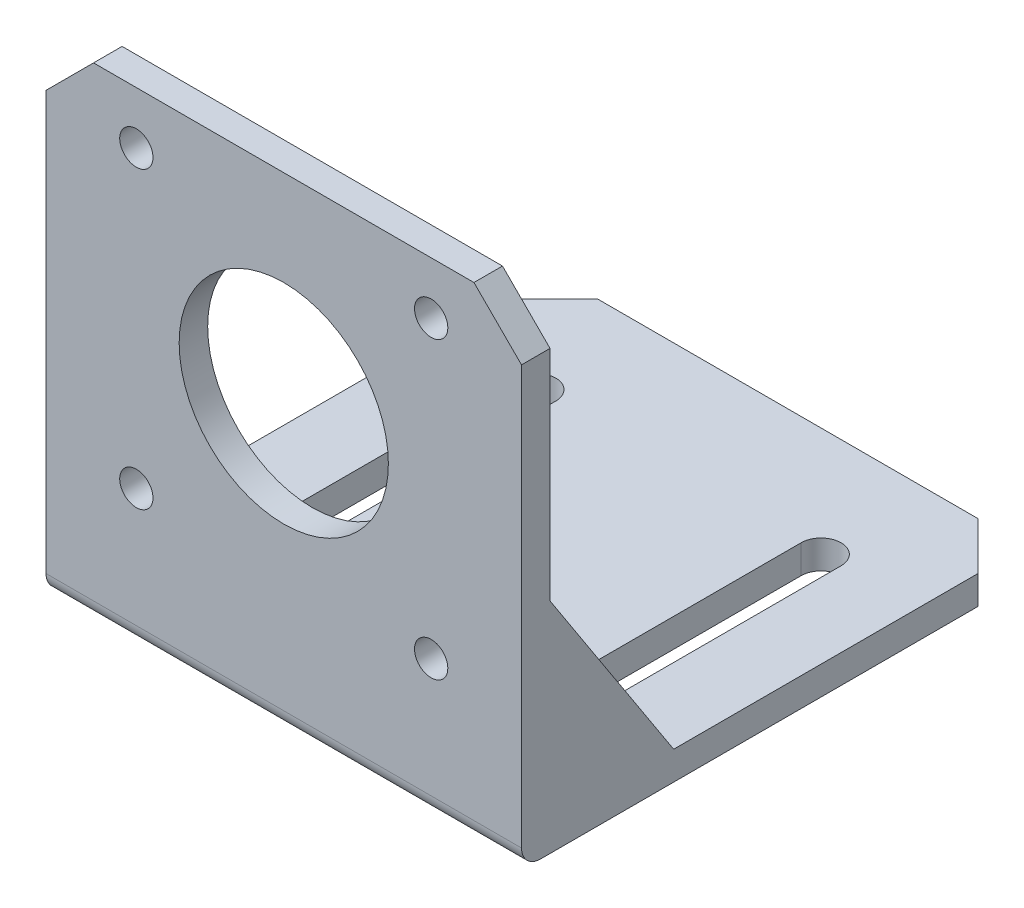
ISO-10303-21;
HEADER;
FILE_DESCRIPTION(('STEP AP214'),'2;1');
FILE_NAME('part.step','',(''),(''),'','','');
FILE_SCHEMA(('AUTOMOTIVE_DESIGN { 1 0 10303 214 1 1 1 1 }'));
ENDSEC;
DATA;
#1=APPLICATION_CONTEXT('core data for automotive mechanical design processes');
#2=APPLICATION_PROTOCOL_DEFINITION('international standard','automotive_design',2000,#1);
#3=PRODUCT_CONTEXT('',#1,'mechanical');
#4=PRODUCT('Part','Part','',(#3));
#5=PRODUCT_RELATED_PRODUCT_CATEGORY('part','',(#4));
#6=PRODUCT_DEFINITION_FORMATION('','',#4);
#7=PRODUCT_DEFINITION_CONTEXT('part definition',#1,'design');
#8=PRODUCT_DEFINITION('design','',#6,#7);
#9=PRODUCT_DEFINITION_SHAPE('','',#8);
#10=(LENGTH_UNIT() NAMED_UNIT(*) SI_UNIT(.MILLI.,.METRE.));
#11=(NAMED_UNIT(*) PLANE_ANGLE_UNIT() SI_UNIT($,.RADIAN.));
#12=(NAMED_UNIT(*) SI_UNIT($,.STERADIAN.) SOLID_ANGLE_UNIT());
#13=UNCERTAINTY_MEASURE_WITH_UNIT(LENGTH_MEASURE(1.E-05),#10,'distance_accuracy_value','');
#14=(GEOMETRIC_REPRESENTATION_CONTEXT(3) GLOBAL_UNCERTAINTY_ASSIGNED_CONTEXT((#13)) GLOBAL_UNIT_ASSIGNED_CONTEXT((#10,
#11,#12)) REPRESENTATION_CONTEXT('',''));
#15=CARTESIAN_POINT('',(0.,0.,0.));
#16=DIRECTION('',(0.,0.,1.));
#17=DIRECTION('',(1.,0.,0.));
#18=AXIS2_PLACEMENT_3D('',#15,#16,#17);
#19=CARTESIAN_POINT('',(50.,3.,-53.));
#20=DIRECTION('',(0.,-1.,0.));
#21=DIRECTION('',(0.,0.,-1.));
#22=AXIS2_PLACEMENT_3D('',#19,#20,#21);
#23=PLANE('',#22);
#24=CARTESIAN_POINT('',(40.,3.,-41.5));
#25=DIRECTION('',(0.,-1.,0.));
#26=DIRECTION('',(0.,0.,-1.));
#27=AXIS2_PLACEMENT_3D('',#24,#25,#26);
#28=CIRCLE('',#27,2.1);
#29=CARTESIAN_POINT('',(42.1,3.,-41.5));
#30=VERTEX_POINT('',#29);
#31=CARTESIAN_POINT('',(37.9,3.,-41.5));
#32=VERTEX_POINT('',#31);
#33=EDGE_CURVE('E260',#30,#32,#28,.F.);
#34=ORIENTED_EDGE('',*,*,#33,.F.);
#35=DIRECTION('',(0.,0.,-1.));
#36=VECTOR('',#35,1.);
#37=CARTESIAN_POINT('',(42.1,3.,-53.));
#38=LINE('',#37,#36);
#39=CARTESIAN_POINT('',(42.1,3.,-11.5));
#40=VERTEX_POINT('',#39);
#41=EDGE_CURVE('E208',#40,#30,#38,.T.);
#42=ORIENTED_EDGE('',*,*,#41,.F.);
#43=CARTESIAN_POINT('',(40.,3.,-11.5));
#44=DIRECTION('',(0.,-1.,0.));
#45=DIRECTION('',(0.,0.,-1.));
#46=AXIS2_PLACEMENT_3D('',#43,#44,#45);
#47=CIRCLE('',#46,2.1);
#48=CARTESIAN_POINT('',(37.9,3.,-11.5));
#49=VERTEX_POINT('',#48);
#50=EDGE_CURVE('E255',#49,#40,#47,.F.);
#51=ORIENTED_EDGE('',*,*,#50,.F.);
#52=DIRECTION('',(0.,0.,1.));
#53=VECTOR('',#52,1.);
#54=CARTESIAN_POINT('',(37.9,3.,-53.));
#55=LINE('',#54,#53);
#56=EDGE_CURVE('E258',#32,#49,#55,.T.);
#57=ORIENTED_EDGE('',*,*,#56,.F.);
#58=EDGE_LOOP('',(#34,#42,#51,#57));
#59=FACE_BOUND('',#58,.T.);
#60=DIRECTION('',(-1.,0.,0.));
#61=VECTOR('',#60,1.);
#62=CARTESIAN_POINT('',(50.,3.,-53.));
#63=LINE('',#62,#61);
#64=CARTESIAN_POINT('',(45.,3.,-53.));
#65=VERTEX_POINT('',#64);
#66=CARTESIAN_POINT('',(4.99999999999999,3.,-53.));
#67=VERTEX_POINT('',#66);
#68=EDGE_CURVE('E369',#65,#67,#63,.T.);
#69=ORIENTED_EDGE('',*,*,#68,.T.);
#70=DIRECTION('',(0.707106781186547,0.,-0.707106781186549));
#71=VECTOR('',#70,1.);
#72=CARTESIAN_POINT('',(4.99999999999999,3.,-53.));
#73=LINE('',#72,#71);
#74=CARTESIAN_POINT('',(0.,3.,-48.));
#75=VERTEX_POINT('',#74);
#76=EDGE_CURVE('E391',#67,#75,#73,.F.);
#77=ORIENTED_EDGE('',*,*,#76,.T.);
#78=DIRECTION('',(0.,0.,1.));
#79=VECTOR('',#78,1.);
#80=CARTESIAN_POINT('',(0.,3.,-53.));
#81=LINE('',#80,#79);
#82=CARTESIAN_POINT('',(0.,3.,-16.));
#83=VERTEX_POINT('',#82);
#84=EDGE_CURVE('E361',#75,#83,#81,.T.);
#85=ORIENTED_EDGE('',*,*,#84,.T.);
#86=DIRECTION('',(-1.,0.,0.));
#87=VECTOR('',#86,1.);
#88=CARTESIAN_POINT('',(3.,3.,-16.));
#89=LINE('',#88,#87);
#90=CARTESIAN_POINT('',(3.,3.,-16.));
#91=VERTEX_POINT('',#90);
#92=EDGE_CURVE('E333',#91,#83,#89,.T.);
#93=ORIENTED_EDGE('',*,*,#92,.F.);
#94=DIRECTION('',(0.,0.,-1.));
#95=VECTOR('',#94,1.);
#96=CARTESIAN_POINT('',(3.,3.,-5.00000000000001));
#97=LINE('',#96,#95);
#98=CARTESIAN_POINT('',(3.,3.,-5.00000000000001));
#99=VERTEX_POINT('',#98);
#100=EDGE_CURVE('E330',#99,#91,#97,.T.);
#101=ORIENTED_EDGE('',*,*,#100,.F.);
#102=DIRECTION('',(-1.,0.,0.));
#103=VECTOR('',#102,1.);
#104=CARTESIAN_POINT('',(50.,3.,-5.00000000000001));
#105=LINE('',#104,#103);
#106=CARTESIAN_POINT('',(47.,3.,-5.00000000000001));
#107=VERTEX_POINT('',#106);
#108=EDGE_CURVE('E367',#107,#99,#105,.T.);
#109=ORIENTED_EDGE('',*,*,#108,.F.);
#110=DIRECTION('',(0.,0.,-1.));
#111=VECTOR('',#110,1.);
#112=CARTESIAN_POINT('',(47.,3.,-5.00000000000001));
#113=LINE('',#112,#111);
#114=CARTESIAN_POINT('',(47.,3.,-16.));
#115=VERTEX_POINT('',#114);
#116=EDGE_CURVE('E310',#107,#115,#113,.T.);
#117=ORIENTED_EDGE('',*,*,#116,.T.);
#118=DIRECTION('',(1.,0.,0.));
#119=VECTOR('',#118,1.);
#120=CARTESIAN_POINT('',(47.,3.,-16.));
#121=LINE('',#120,#119);
#122=CARTESIAN_POINT('',(50.,3.,-16.));
#123=VERTEX_POINT('',#122);
#124=EDGE_CURVE('E315',#115,#123,#121,.T.);
#125=ORIENTED_EDGE('',*,*,#124,.T.);
#126=DIRECTION('',(0.,0.,1.));
#127=VECTOR('',#126,1.);
#128=CARTESIAN_POINT('',(50.,3.,-53.));
#129=LINE('',#128,#127);
#130=CARTESIAN_POINT('',(50.,3.,-48.));
#131=VERTEX_POINT('',#130);
#132=EDGE_CURVE('E349',#131,#123,#129,.T.);
#133=ORIENTED_EDGE('',*,*,#132,.F.);
#134=DIRECTION('',(-0.707106781186549,0.,-0.707106781186547));
#135=VECTOR('',#134,1.);
#136=CARTESIAN_POINT('',(50.,3.,-48.));
#137=LINE('',#136,#135);
#138=EDGE_CURVE('E389',#131,#65,#137,.T.);
#139=ORIENTED_EDGE('',*,*,#138,.T.);
#140=EDGE_LOOP('',(#69,#77,#85,#93,#101,#109,#117,#125,#133,#139));
#141=FACE_BOUND('',#140,.T.);
#142=CARTESIAN_POINT('',(10.,3.,-41.5));
#143=DIRECTION('',(0.,-1.,0.));
#144=DIRECTION('',(0.,0.,-1.));
#145=AXIS2_PLACEMENT_3D('',#142,#143,#144);
#146=CIRCLE('',#145,2.1);
#147=CARTESIAN_POINT('',(12.1,3.,-41.5));
#148=VERTEX_POINT('',#147);
#149=CARTESIAN_POINT('',(7.9,3.,-41.5));
#150=VERTEX_POINT('',#149);
#151=EDGE_CURVE('E205',#148,#150,#146,.F.);
#152=ORIENTED_EDGE('',*,*,#151,.F.);
#153=DIRECTION('',(0.,0.,-1.));
#154=VECTOR('',#153,1.);
#155=CARTESIAN_POINT('',(12.1,3.,-53.));
#156=LINE('',#155,#154);
#157=CARTESIAN_POINT('',(12.1,3.,-11.5));
#158=VERTEX_POINT('',#157);
#159=EDGE_CURVE('E262',#158,#148,#156,.T.);
#160=ORIENTED_EDGE('',*,*,#159,.F.);
#161=CARTESIAN_POINT('',(10.,3.,-11.5));
#162=DIRECTION('',(0.,-1.,0.));
#163=DIRECTION('',(0.,0.,-1.));
#164=AXIS2_PLACEMENT_3D('',#161,#162,#163);
#165=CIRCLE('',#164,2.1);
#166=CARTESIAN_POINT('',(7.9,3.,-11.5));
#167=VERTEX_POINT('',#166);
#168=EDGE_CURVE('E264',#167,#158,#165,.F.);
#169=ORIENTED_EDGE('',*,*,#168,.F.);
#170=DIRECTION('',(0.,0.,1.));
#171=VECTOR('',#170,1.);
#172=CARTESIAN_POINT('',(7.9,3.,-53.));
#173=LINE('',#172,#171);
#174=EDGE_CURVE('E267',#150,#167,#173,.T.);
#175=ORIENTED_EDGE('',*,*,#174,.F.);
#176=EDGE_LOOP('',(#152,#160,#169,#175));
#177=FACE_BOUND('',#176,.T.);
#178=ADVANCED_FACE('F36',(#59,#141,#177),#23,.F.);
#179=CARTESIAN_POINT('',(50.,0.,-2.00000000000001));
#180=DIRECTION('',(0.,1.,0.));
#181=DIRECTION('',(0.,0.,1.));
#182=AXIS2_PLACEMENT_3D('',#179,#180,#181);
#183=PLANE('',#182);
#184=CARTESIAN_POINT('',(40.,0.,-41.5));
#185=DIRECTION('',(0.,1.,0.));
#186=DIRECTION('',(0.,0.,1.));
#187=AXIS2_PLACEMENT_3D('',#184,#185,#186);
#188=CIRCLE('',#187,2.1);
#189=CARTESIAN_POINT('',(42.1,0.,-41.5));
#190=VERTEX_POINT('',#189);
#191=CARTESIAN_POINT('',(37.9,0.,-41.5));
#192=VERTEX_POINT('',#191);
#193=EDGE_CURVE('E236',#190,#192,#188,.T.);
#194=ORIENTED_EDGE('',*,*,#193,.T.);
#195=DIRECTION('',(0.,0.,1.));
#196=VECTOR('',#195,1.);
#197=CARTESIAN_POINT('',(37.9,0.,-41.5));
#198=LINE('',#197,#196);
#199=CARTESIAN_POINT('',(37.9,0.,-11.5));
#200=VERTEX_POINT('',#199);
#201=EDGE_CURVE('E239',#192,#200,#198,.T.);
#202=ORIENTED_EDGE('',*,*,#201,.T.);
#203=CARTESIAN_POINT('',(40.,0.,-11.5));
#204=DIRECTION('',(0.,1.,0.));
#205=DIRECTION('',(0.,0.,1.));
#206=AXIS2_PLACEMENT_3D('',#203,#204,#205);
#207=CIRCLE('',#206,2.1);
#208=CARTESIAN_POINT('',(42.1,0.,-11.5));
#209=VERTEX_POINT('',#208);
#210=EDGE_CURVE('E242',#200,#209,#207,.T.);
#211=ORIENTED_EDGE('',*,*,#210,.T.);
#212=DIRECTION('',(0.,0.,-1.));
#213=VECTOR('',#212,1.);
#214=CARTESIAN_POINT('',(42.1,0.,-41.5));
#215=LINE('',#214,#213);
#216=EDGE_CURVE('E245',#209,#190,#215,.T.);
#217=ORIENTED_EDGE('',*,*,#216,.T.);
#218=EDGE_LOOP('',(#194,#202,#211,#217));
#219=FACE_BOUND('',#218,.T.);
#220=DIRECTION('',(0.,0.,-1.));
#221=VECTOR('',#220,1.);
#222=CARTESIAN_POINT('',(0.,0.,-2.00000000000001));
#223=LINE('',#222,#221);
#224=CARTESIAN_POINT('',(0.,0.,-2.00000000000001));
#225=VERTEX_POINT('',#224);
#226=CARTESIAN_POINT('',(0.,0.,-48.));
#227=VERTEX_POINT('',#226);
#228=EDGE_CURVE('E358',#225,#227,#223,.T.);
#229=ORIENTED_EDGE('',*,*,#228,.T.);
#230=DIRECTION('',(-0.707106781186546,0.,0.707106781186548));
#231=VECTOR('',#230,1.);
#232=CARTESIAN_POINT('',(4.99999999999999,0.,-53.));
#233=LINE('',#232,#231);
#234=CARTESIAN_POINT('',(4.99999999999999,0.,-53.));
#235=VERTEX_POINT('',#234);
#236=EDGE_CURVE('E399',#227,#235,#233,.F.);
#237=ORIENTED_EDGE('',*,*,#236,.T.);
#238=DIRECTION('',(-1.,0.,0.));
#239=VECTOR('',#238,1.);
#240=CARTESIAN_POINT('',(50.,0.,-53.));
#241=LINE('',#240,#239);
#242=CARTESIAN_POINT('',(45.,0.,-53.));
#243=VERTEX_POINT('',#242);
#244=EDGE_CURVE('E372',#243,#235,#241,.T.);
#245=ORIENTED_EDGE('',*,*,#244,.F.);
#246=DIRECTION('',(0.707106781186549,0.,0.707106781186547));
#247=VECTOR('',#246,1.);
#248=CARTESIAN_POINT('',(50.,0.,-48.));
#249=LINE('',#248,#247);
#250=CARTESIAN_POINT('',(50.,0.,-48.));
#251=VERTEX_POINT('',#250);
#252=EDGE_CURVE('E397',#243,#251,#249,.T.);
#253=ORIENTED_EDGE('',*,*,#252,.T.);
#254=DIRECTION('',(0.,0.,-1.));
#255=VECTOR('',#254,1.);
#256=CARTESIAN_POINT('',(50.,0.,-2.00000000000001));
#257=LINE('',#256,#255);
#258=CARTESIAN_POINT('',(50.,0.,-2.00000000000001));
#259=VERTEX_POINT('',#258);
#260=EDGE_CURVE('E346',#259,#251,#257,.T.);
#261=ORIENTED_EDGE('',*,*,#260,.F.);
#262=DIRECTION('',(-1.,0.,0.));
#263=VECTOR('',#262,1.);
#264=CARTESIAN_POINT('',(50.,0.,-2.00000000000001));
#265=LINE('',#264,#263);
#266=EDGE_CURVE('E375',#259,#225,#265,.T.);
#267=ORIENTED_EDGE('',*,*,#266,.T.);
#268=EDGE_LOOP('',(#229,#237,#245,#253,#261,#267));
#269=FACE_BOUND('',#268,.T.);
#270=CARTESIAN_POINT('',(10.,0.,-41.5));
#271=DIRECTION('',(0.,1.,0.));
#272=DIRECTION('',(0.,0.,1.));
#273=AXIS2_PLACEMENT_3D('',#270,#271,#272);
#274=CIRCLE('',#273,2.1);
#275=CARTESIAN_POINT('',(12.1,0.,-41.5));
#276=VERTEX_POINT('',#275);
#277=CARTESIAN_POINT('',(7.9,0.,-41.5));
#278=VERTEX_POINT('',#277);
#279=EDGE_CURVE('E202',#276,#278,#274,.T.);
#280=ORIENTED_EDGE('',*,*,#279,.T.);
#281=DIRECTION('',(0.,0.,1.));
#282=VECTOR('',#281,1.);
#283=CARTESIAN_POINT('',(7.9,0.,-41.5));
#284=LINE('',#283,#282);
#285=CARTESIAN_POINT('',(7.9,0.,-11.5));
#286=VERTEX_POINT('',#285);
#287=EDGE_CURVE('E212',#278,#286,#284,.T.);
#288=ORIENTED_EDGE('',*,*,#287,.T.);
#289=CARTESIAN_POINT('',(10.,0.,-11.5));
#290=DIRECTION('',(0.,1.,0.));
#291=DIRECTION('',(0.,0.,1.));
#292=AXIS2_PLACEMENT_3D('',#289,#290,#291);
#293=CIRCLE('',#292,2.1);
#294=CARTESIAN_POINT('',(12.1,0.,-11.5));
#295=VERTEX_POINT('',#294);
#296=EDGE_CURVE('E218',#286,#295,#293,.T.);
#297=ORIENTED_EDGE('',*,*,#296,.T.);
#298=DIRECTION('',(0.,0.,-1.));
#299=VECTOR('',#298,1.);
#300=CARTESIAN_POINT('',(12.1,0.,-11.5));
#301=LINE('',#300,#299);
#302=EDGE_CURVE('E223',#295,#276,#301,.T.);
#303=ORIENTED_EDGE('',*,*,#302,.T.);
#304=EDGE_LOOP('',(#280,#288,#297,#303));
#305=FACE_BOUND('',#304,.T.);
#306=ADVANCED_FACE('F221',(#219,#269,#305),#183,.F.);
#307=CARTESIAN_POINT('',(50.,5.,-5.));
#308=DIRECTION('',(-1.,0.,0.));
#309=DIRECTION('',(0.,0.,1.));
#310=AXIS2_PLACEMENT_3D('',#307,#308,#309);
#311=CYLINDRICAL_SURFACE('',#310,2.);
#312=CARTESIAN_POINT('',(47.,5.,-5.));
#313=DIRECTION('',(1.,0.,0.));
#314=DIRECTION('',(0.,0.,-1.));
#315=AXIS2_PLACEMENT_3D('',#312,#313,#314);
#316=CIRCLE('',#315,2.);
#317=CARTESIAN_POINT('',(47.,5.00000000000002,-3.));
#318=VERTEX_POINT('',#317);
#319=EDGE_CURVE('E307',#318,#107,#316,.T.);
#320=ORIENTED_EDGE('',*,*,#319,.T.);
#321=ORIENTED_EDGE('',*,*,#108,.T.);
#322=CARTESIAN_POINT('',(3.,5.,-5.));
#323=DIRECTION('',(1.,0.,0.));
#324=DIRECTION('',(0.,0.,-1.));
#325=AXIS2_PLACEMENT_3D('',#322,#323,#324);
#326=CIRCLE('',#325,2.);
#327=CARTESIAN_POINT('',(3.,5.,-3.));
#328=VERTEX_POINT('',#327);
#329=EDGE_CURVE('E327',#328,#99,#326,.T.);
#330=ORIENTED_EDGE('',*,*,#329,.F.);
#331=DIRECTION('',(-1.,0.,0.));
#332=VECTOR('',#331,1.);
#333=CARTESIAN_POINT('',(50.,5.,-3.));
#334=LINE('',#333,#332);
#335=EDGE_CURVE('E365',#318,#328,#334,.T.);
#336=ORIENTED_EDGE('',*,*,#335,.F.);
#337=EDGE_LOOP('',(#320,#321,#330,#336));
#338=FACE_BOUND('',#337,.T.);
#339=ADVANCED_FACE('F474',(#338),#311,.F.);
#340=CARTESIAN_POINT('',(50.,5.00000000000002,-3.));
#341=DIRECTION('',(0.,0.,1.));
#342=DIRECTION('',(1.,0.,0.));
#343=AXIS2_PLACEMENT_3D('',#340,#341,#342);
#344=PLANE('',#343);
#345=CARTESIAN_POINT('',(40.5,14.5,-3.));
#346=DIRECTION('',(0.,0.,1.));
#347=DIRECTION('',(1.,0.,0.));
#348=AXIS2_PLACEMENT_3D('',#345,#346,#347);
#349=CIRCLE('',#348,1.75);
#350=CARTESIAN_POINT('',(42.25,14.5,-3.));
#351=VERTEX_POINT('',#350);
#352=EDGE_CURVE('E290',#351,#351,#349,.T.);
#353=ORIENTED_EDGE('',*,*,#352,.T.);
#354=EDGE_LOOP('',(#353));
#355=FACE_BOUND('',#354,.T.);
#356=CARTESIAN_POINT('',(9.5,14.5,-3.));
#357=DIRECTION('',(0.,0.,1.));
#358=DIRECTION('',(1.,0.,0.));
#359=AXIS2_PLACEMENT_3D('',#356,#357,#358);
#360=CIRCLE('',#359,1.75);
#361=CARTESIAN_POINT('',(11.25,14.5,-3.));
#362=VERTEX_POINT('',#361);
#363=EDGE_CURVE('E284',#362,#362,#360,.T.);
#364=ORIENTED_EDGE('',*,*,#363,.T.);
#365=EDGE_LOOP('',(#364));
#366=FACE_BOUND('',#365,.T.);
#367=CARTESIAN_POINT('',(25.,30.,-3.));
#368=DIRECTION('',(0.,0.,1.));
#369=DIRECTION('',(1.,0.,0.));
#370=AXIS2_PLACEMENT_3D('',#367,#368,#369);
#371=CIRCLE('',#370,11.);
#372=CARTESIAN_POINT('',(36.,30.,-3.));
#373=VERTEX_POINT('',#372);
#374=EDGE_CURVE('E278',#373,#373,#371,.T.);
#375=ORIENTED_EDGE('',*,*,#374,.T.);
#376=EDGE_LOOP('',(#375));
#377=FACE_BOUND('',#376,.T.);
#378=CARTESIAN_POINT('',(40.5,45.5,-3.));
#379=DIRECTION('',(0.,0.,1.));
#380=DIRECTION('',(1.,0.,0.));
#381=AXIS2_PLACEMENT_3D('',#378,#379,#380);
#382=CIRCLE('',#381,1.75);
#383=CARTESIAN_POINT('',(42.25,45.5,-3.));
#384=VERTEX_POINT('',#383);
#385=EDGE_CURVE('E271',#384,#384,#382,.T.);
#386=ORIENTED_EDGE('',*,*,#385,.T.);
#387=EDGE_LOOP('',(#386));
#388=FACE_BOUND('',#387,.T.);
#389=CARTESIAN_POINT('',(9.5,45.5,-3.));
#390=DIRECTION('',(0.,0.,1.));
#391=DIRECTION('',(1.,0.,0.));
#392=AXIS2_PLACEMENT_3D('',#389,#390,#391);
#393=CIRCLE('',#392,1.75);
#394=CARTESIAN_POINT('',(11.25,45.5,-3.));
#395=VERTEX_POINT('',#394);
#396=EDGE_CURVE('E295',#395,#395,#393,.T.);
#397=ORIENTED_EDGE('',*,*,#396,.T.);
#398=EDGE_LOOP('',(#397));
#399=FACE_BOUND('',#398,.T.);
#400=DIRECTION('',(0.,1.,0.));
#401=VECTOR('',#400,1.);
#402=CARTESIAN_POINT('',(0.,5.00000000000002,-3.));
#403=LINE('',#402,#401);
#404=CARTESIAN_POINT('',(0.,23.,-3.));
#405=VERTEX_POINT('',#404);
#406=CARTESIAN_POINT('',(0.,46.,-3.));
#407=VERTEX_POINT('',#406);
#408=EDGE_CURVE('E344',#405,#407,#403,.T.);
#409=ORIENTED_EDGE('',*,*,#408,.T.);
#410=DIRECTION('',(-0.707106781186547,-0.707106781186549,0.));
#411=VECTOR('',#410,1.);
#412=CARTESIAN_POINT('',(4.99999999999999,51.,-3.));
#413=LINE('',#412,#411);
#414=CARTESIAN_POINT('',(4.99999999999999,51.,-3.));
#415=VERTEX_POINT('',#414);
#416=EDGE_CURVE('E11',#407,#415,#413,.F.);
#417=ORIENTED_EDGE('',*,*,#416,.T.);
#418=DIRECTION('',(-1.,0.,0.));
#419=VECTOR('',#418,1.);
#420=CARTESIAN_POINT('',(50.,51.,-3.));
#421=LINE('',#420,#419);
#422=CARTESIAN_POINT('',(45.,51.,-3.));
#423=VERTEX_POINT('',#422);
#424=EDGE_CURVE('E354',#423,#415,#421,.T.);
#425=ORIENTED_EDGE('',*,*,#424,.F.);
#426=DIRECTION('',(0.707106781186549,-0.707106781186547,0.));
#427=VECTOR('',#426,1.);
#428=CARTESIAN_POINT('',(50.,46.,-3.));
#429=LINE('',#428,#427);
#430=CARTESIAN_POINT('',(50.,46.,-3.));
#431=VERTEX_POINT('',#430);
#432=EDGE_CURVE('E45',#423,#431,#429,.T.);
#433=ORIENTED_EDGE('',*,*,#432,.T.);
#434=DIRECTION('',(0.,1.,0.));
#435=VECTOR('',#434,1.);
#436=CARTESIAN_POINT('',(50.,5.00000000000002,-3.));
#437=LINE('',#436,#435);
#438=CARTESIAN_POINT('',(50.,23.,-3.));
#439=VERTEX_POINT('',#438);
#440=EDGE_CURVE('E351',#439,#431,#437,.T.);
#441=ORIENTED_EDGE('',*,*,#440,.F.);
#442=DIRECTION('',(1.,0.,0.));
#443=VECTOR('',#442,1.);
#444=CARTESIAN_POINT('',(47.,23.,-3.));
#445=LINE('',#444,#443);
#446=CARTESIAN_POINT('',(47.,23.,-3.));
#447=VERTEX_POINT('',#446);
#448=EDGE_CURVE('E313',#447,#439,#445,.T.);
#449=ORIENTED_EDGE('',*,*,#448,.F.);
#450=DIRECTION('',(0.,-1.,0.));
#451=VECTOR('',#450,1.);
#452=CARTESIAN_POINT('',(47.,23.,-3.));
#453=LINE('',#452,#451);
#454=EDGE_CURVE('E304',#447,#318,#453,.T.);
#455=ORIENTED_EDGE('',*,*,#454,.T.);
#456=ORIENTED_EDGE('',*,*,#335,.T.);
#457=DIRECTION('',(0.,-1.,0.));
#458=VECTOR('',#457,1.);
#459=CARTESIAN_POINT('',(3.,5.00000000000002,-3.));
#460=LINE('',#459,#458);
#461=CARTESIAN_POINT('',(3.,23.,-3.));
#462=VERTEX_POINT('',#461);
#463=EDGE_CURVE('E324',#462,#328,#460,.T.);
#464=ORIENTED_EDGE('',*,*,#463,.F.);
#465=DIRECTION('',(-1.,0.,0.));
#466=VECTOR('',#465,1.);
#467=CARTESIAN_POINT('',(3.,23.,-3.));
#468=LINE('',#467,#466);
#469=EDGE_CURVE('E338',#462,#405,#468,.T.);
#470=ORIENTED_EDGE('',*,*,#469,.T.);
#471=EDGE_LOOP('',(#409,#417,#425,#433,#441,#449,#455,#456,#464,#470));
#472=FACE_BOUND('',#471,.T.);
#473=ADVANCED_FACE('F416',(#355,#366,#377,#388,#399,#472),#344,.F.);
#474=CARTESIAN_POINT('',(50.,51.,-3.));
#475=DIRECTION('',(0.,-1.,0.));
#476=DIRECTION('',(0.,0.,-1.));
#477=AXIS2_PLACEMENT_3D('',#474,#475,#476);
#478=PLANE('',#477);
#479=ORIENTED_EDGE('',*,*,#424,.T.);
#480=DIRECTION('',(0.,0.,1.));
#481=VECTOR('',#480,1.);
#482=CARTESIAN_POINT('',(4.99999999999999,51.,-3.));
#483=LINE('',#482,#481);
#484=CARTESIAN_POINT('',(4.99999999999999,51.,0.));
#485=VERTEX_POINT('',#484);
#486=EDGE_CURVE('E408',#415,#485,#483,.T.);
#487=ORIENTED_EDGE('',*,*,#486,.T.);
#488=DIRECTION('',(-1.,0.,0.));
#489=VECTOR('',#488,1.);
#490=CARTESIAN_POINT('',(50.,51.,0.));
#491=LINE('',#490,#489);
#492=CARTESIAN_POINT('',(45.,51.,0.));
#493=VERTEX_POINT('',#492);
#494=EDGE_CURVE('E381',#493,#485,#491,.T.);
#495=ORIENTED_EDGE('',*,*,#494,.F.);
#496=DIRECTION('',(0.,0.,-1.));
#497=VECTOR('',#496,1.);
#498=CARTESIAN_POINT('',(45.,51.,-3.));
#499=LINE('',#498,#497);
#500=EDGE_CURVE('E57',#493,#423,#499,.T.);
#501=ORIENTED_EDGE('',*,*,#500,.T.);
#502=EDGE_LOOP('',(#479,#487,#495,#501));
#503=FACE_BOUND('',#502,.T.);
#504=ADVANCED_FACE('F427',(#503),#478,.F.);
#505=CARTESIAN_POINT('',(50.,2.00000000000001,0.));
#506=DIRECTION('',(0.,0.,-1.));
#507=DIRECTION('',(-1.,0.,0.));
#508=AXIS2_PLACEMENT_3D('',#505,#506,#507);
#509=PLANE('',#508);
#510=CARTESIAN_POINT('',(40.5,14.5,0.));
#511=DIRECTION('',(0.,0.,1.));
#512=DIRECTION('',(1.,0.,0.));
#513=AXIS2_PLACEMENT_3D('',#510,#511,#512);
#514=CIRCLE('',#513,1.75);
#515=CARTESIAN_POINT('',(42.25,14.5,0.));
#516=VERTEX_POINT('',#515);
#517=EDGE_CURVE('E270',#516,#516,#514,.T.);
#518=ORIENTED_EDGE('',*,*,#517,.F.);
#519=EDGE_LOOP('',(#518));
#520=FACE_BOUND('',#519,.T.);
#521=CARTESIAN_POINT('',(9.5,14.5,0.));
#522=DIRECTION('',(0.,0.,1.));
#523=DIRECTION('',(1.,0.,0.));
#524=AXIS2_PLACEMENT_3D('',#521,#522,#523);
#525=CIRCLE('',#524,1.75);
#526=CARTESIAN_POINT('',(11.25,14.5,0.));
#527=VERTEX_POINT('',#526);
#528=EDGE_CURVE('E287',#527,#527,#525,.T.);
#529=ORIENTED_EDGE('',*,*,#528,.F.);
#530=EDGE_LOOP('',(#529));
#531=FACE_BOUND('',#530,.T.);
#532=CARTESIAN_POINT('',(25.,30.,0.));
#533=DIRECTION('',(0.,0.,1.));
#534=DIRECTION('',(1.,0.,0.));
#535=AXIS2_PLACEMENT_3D('',#532,#533,#534);
#536=CIRCLE('',#535,11.);
#537=CARTESIAN_POINT('',(36.,30.,0.));
#538=VERTEX_POINT('',#537);
#539=EDGE_CURVE('E281',#538,#538,#536,.T.);
#540=ORIENTED_EDGE('',*,*,#539,.F.);
#541=EDGE_LOOP('',(#540));
#542=FACE_BOUND('',#541,.T.);
#543=CARTESIAN_POINT('',(40.5,45.5,0.));
#544=DIRECTION('',(0.,0.,1.));
#545=DIRECTION('',(1.,0.,0.));
#546=AXIS2_PLACEMENT_3D('',#543,#544,#545);
#547=CIRCLE('',#546,1.75);
#548=CARTESIAN_POINT('',(42.25,45.5,0.));
#549=VERTEX_POINT('',#548);
#550=EDGE_CURVE('E275',#549,#549,#547,.T.);
#551=ORIENTED_EDGE('',*,*,#550,.F.);
#552=EDGE_LOOP('',(#551));
#553=FACE_BOUND('',#552,.T.);
#554=CARTESIAN_POINT('',(9.5,45.5,0.));
#555=DIRECTION('',(0.,0.,1.));
#556=DIRECTION('',(1.,0.,0.));
#557=AXIS2_PLACEMENT_3D('',#554,#555,#556);
#558=CIRCLE('',#557,1.75);
#559=CARTESIAN_POINT('',(11.25,45.5,0.));
#560=VERTEX_POINT('',#559);
#561=EDGE_CURVE('E274',#560,#560,#558,.T.);
#562=ORIENTED_EDGE('',*,*,#561,.F.);
#563=EDGE_LOOP('',(#562));
#564=FACE_BOUND('',#563,.T.);
#565=ORIENTED_EDGE('',*,*,#494,.T.);
#566=DIRECTION('',(0.707106781186546,0.707106781186548,0.));
#567=VECTOR('',#566,1.);
#568=CARTESIAN_POINT('',(4.99999999999999,51.,0.));
#569=LINE('',#568,#567);
#570=CARTESIAN_POINT('',(0.,46.,0.));
#571=VERTEX_POINT('',#570);
#572=EDGE_CURVE('E413',#485,#571,#569,.F.);
#573=ORIENTED_EDGE('',*,*,#572,.T.);
#574=DIRECTION('',(0.,-1.,0.));
#575=VECTOR('',#574,1.);
#576=CARTESIAN_POINT('',(0.,2.00000000000001,0.));
#577=LINE('',#576,#575);
#578=CARTESIAN_POINT('',(0.,2.00000000000001,0.));
#579=VERTEX_POINT('',#578);
#580=EDGE_CURVE('E340',#571,#579,#577,.T.);
#581=ORIENTED_EDGE('',*,*,#580,.T.);
#582=DIRECTION('',(-1.,0.,0.));
#583=VECTOR('',#582,1.);
#584=CARTESIAN_POINT('',(50.,2.00000000000001,0.));
#585=LINE('',#584,#583);
#586=CARTESIAN_POINT('',(50.,2.00000000000001,0.));
#587=VERTEX_POINT('',#586);
#588=EDGE_CURVE('E378',#587,#579,#585,.T.);
#589=ORIENTED_EDGE('',*,*,#588,.F.);
#590=DIRECTION('',(0.,-1.,0.));
#591=VECTOR('',#590,1.);
#592=CARTESIAN_POINT('',(50.,2.00000000000001,0.));
#593=LINE('',#592,#591);
#594=CARTESIAN_POINT('',(50.,46.,0.));
#595=VERTEX_POINT('',#594);
#596=EDGE_CURVE('E341',#595,#587,#593,.T.);
#597=ORIENTED_EDGE('',*,*,#596,.F.);
#598=DIRECTION('',(-0.707106781186549,0.707106781186547,0.));
#599=VECTOR('',#598,1.);
#600=CARTESIAN_POINT('',(50.,46.,0.));
#601=LINE('',#600,#599);
#602=EDGE_CURVE('E411',#595,#493,#601,.T.);
#603=ORIENTED_EDGE('',*,*,#602,.T.);
#604=EDGE_LOOP('',(#565,#573,#581,#589,#597,#603));
#605=FACE_BOUND('',#604,.T.);
#606=ADVANCED_FACE('F425',(#520,#531,#542,#553,#564,#605),#509,.F.);
#607=CARTESIAN_POINT('',(50.,2.,-2.));
#608=DIRECTION('',(-1.,0.,0.));
#609=DIRECTION('',(0.,0.,1.));
#610=AXIS2_PLACEMENT_3D('',#607,#608,#609);
#611=CYLINDRICAL_SURFACE('',#610,2.);
#612=CARTESIAN_POINT('',(0.,2.,-2.));
#613=DIRECTION('',(1.,0.,0.));
#614=DIRECTION('',(0.,0.,-1.));
#615=AXIS2_PLACEMENT_3D('',#612,#613,#614);
#616=CIRCLE('',#615,2.);
#617=EDGE_CURVE('E356',#579,#225,#616,.T.);
#618=ORIENTED_EDGE('',*,*,#617,.T.);
#619=ORIENTED_EDGE('',*,*,#266,.F.);
#620=CARTESIAN_POINT('',(50.,2.,-2.));
#621=DIRECTION('',(1.,0.,0.));
#622=DIRECTION('',(0.,0.,-1.));
#623=AXIS2_PLACEMENT_3D('',#620,#621,#622);
#624=CIRCLE('',#623,2.);
#625=EDGE_CURVE('E343',#587,#259,#624,.T.);
#626=ORIENTED_EDGE('',*,*,#625,.F.);
#627=ORIENTED_EDGE('',*,*,#588,.T.);
#628=EDGE_LOOP('',(#618,#619,#626,#627));
#629=FACE_BOUND('',#628,.T.);
#630=ADVANCED_FACE('F441',(#629),#611,.T.);
#631=CARTESIAN_POINT('',(50.,0.,-53.));
#632=DIRECTION('',(0.,0.,1.));
#633=DIRECTION('',(1.,0.,0.));
#634=AXIS2_PLACEMENT_3D('',#631,#632,#633);
#635=PLANE('',#634);
#636=ORIENTED_EDGE('',*,*,#244,.T.);
#637=DIRECTION('',(0.,1.,0.));
#638=VECTOR('',#637,1.);
#639=CARTESIAN_POINT('',(4.99999999999999,0.,-53.));
#640=LINE('',#639,#638);
#641=EDGE_CURVE('E386',#235,#67,#640,.T.);
#642=ORIENTED_EDGE('',*,*,#641,.T.);
#643=ORIENTED_EDGE('',*,*,#68,.F.);
#644=DIRECTION('',(0.,-1.,0.));
#645=VECTOR('',#644,1.);
#646=CARTESIAN_POINT('',(45.,0.,-53.));
#647=LINE('',#646,#645);
#648=EDGE_CURVE('E384',#65,#243,#647,.T.);
#649=ORIENTED_EDGE('',*,*,#648,.T.);
#650=EDGE_LOOP('',(#636,#642,#643,#649));
#651=FACE_BOUND('',#650,.T.);
#652=ADVANCED_FACE('F457',(#651),#635,.F.);
#653=CARTESIAN_POINT('',(50.,2.,-2.));
#654=DIRECTION('',(1.,0.,0.));
#655=DIRECTION('',(0.,0.,-1.));
#656=AXIS2_PLACEMENT_3D('',#653,#654,#655);
#657=PLANE('',#656);
#658=ORIENTED_EDGE('',*,*,#260,.T.);
#659=DIRECTION('',(0.,1.,0.));
#660=VECTOR('',#659,1.);
#661=CARTESIAN_POINT('',(50.,3.,-48.));
#662=LINE('',#661,#660);
#663=EDGE_CURVE('E404',#251,#131,#662,.T.);
#664=ORIENTED_EDGE('',*,*,#663,.T.);
#665=ORIENTED_EDGE('',*,*,#132,.T.);
#666=DIRECTION('',(0.,0.838443616300637,0.544988350595414));
#667=VECTOR('',#666,1.);
#668=CARTESIAN_POINT('',(50.,3.,-16.));
#669=LINE('',#668,#667);
#670=EDGE_CURVE('E298',#123,#439,#669,.T.);
#671=ORIENTED_EDGE('',*,*,#670,.T.);
#672=ORIENTED_EDGE('',*,*,#440,.T.);
#673=DIRECTION('',(0.,0.,1.));
#674=VECTOR('',#673,1.);
#675=CARTESIAN_POINT('',(50.,46.,0.));
#676=LINE('',#675,#674);
#677=EDGE_CURVE('E401',#431,#595,#676,.T.);
#678=ORIENTED_EDGE('',*,*,#677,.T.);
#679=ORIENTED_EDGE('',*,*,#596,.T.);
#680=ORIENTED_EDGE('',*,*,#625,.T.);
#681=EDGE_LOOP('',(#658,#664,#665,#671,#672,#678,#679,#680));
#682=FACE_BOUND('',#681,.T.);
#683=ADVANCED_FACE('F421',(#682),#657,.T.);
#684=CARTESIAN_POINT('',(0.,2.,-2.));
#685=DIRECTION('',(1.,0.,0.));
#686=DIRECTION('',(0.,0.,-1.));
#687=AXIS2_PLACEMENT_3D('',#684,#685,#686);
#688=PLANE('',#687);
#689=ORIENTED_EDGE('',*,*,#84,.F.);
#690=DIRECTION('',(0.,-1.,0.));
#691=VECTOR('',#690,1.);
#692=CARTESIAN_POINT('',(0.,2.,-48.));
#693=LINE('',#692,#691);
#694=EDGE_CURVE('E395',#75,#227,#693,.T.);
#695=ORIENTED_EDGE('',*,*,#694,.T.);
#696=ORIENTED_EDGE('',*,*,#228,.F.);
#697=ORIENTED_EDGE('',*,*,#617,.F.);
#698=ORIENTED_EDGE('',*,*,#580,.F.);
#699=DIRECTION('',(0.,0.,-1.));
#700=VECTOR('',#699,1.);
#701=CARTESIAN_POINT('',(0.,46.,-2.));
#702=LINE('',#701,#700);
#703=EDGE_CURVE('E393',#571,#407,#702,.T.);
#704=ORIENTED_EDGE('',*,*,#703,.T.);
#705=ORIENTED_EDGE('',*,*,#408,.F.);
#706=DIRECTION('',(0.,0.838443616300637,0.544988350595414));
#707=VECTOR('',#706,1.);
#708=CARTESIAN_POINT('',(0.,3.,-16.));
#709=LINE('',#708,#707);
#710=EDGE_CURVE('E318',#83,#405,#709,.T.);
#711=ORIENTED_EDGE('',*,*,#710,.F.);
#712=EDGE_LOOP('',(#689,#695,#696,#697,#698,#704,#705,#711));
#713=FACE_BOUND('',#712,.T.);
#714=ADVANCED_FACE('F436',(#713),#688,.F.);
#715=CARTESIAN_POINT('',(3.,3.,-16.));
#716=DIRECTION('',(0.,-0.544988350595414,0.838443616300637));
#717=DIRECTION('',(0.,-0.838443616300637,-0.544988350595414));
#718=AXIS2_PLACEMENT_3D('',#715,#716,#717);
#719=PLANE('',#718);
#720=ORIENTED_EDGE('',*,*,#710,.T.);
#721=ORIENTED_EDGE('',*,*,#469,.F.);
#722=DIRECTION('',(0.,0.838443616300637,0.544988350595414));
#723=VECTOR('',#722,1.);
#724=CARTESIAN_POINT('',(3.,3.,-16.));
#725=LINE('',#724,#723);
#726=EDGE_CURVE('E321',#91,#462,#725,.T.);
#727=ORIENTED_EDGE('',*,*,#726,.F.);
#728=ORIENTED_EDGE('',*,*,#92,.T.);
#729=EDGE_LOOP('',(#720,#721,#727,#728));
#730=FACE_BOUND('',#729,.T.);
#731=ADVANCED_FACE('F465',(#730),#719,.F.);
#732=CARTESIAN_POINT('',(3.,5.,-5.));
#733=DIRECTION('',(1.,0.,0.));
#734=DIRECTION('',(0.,0.,-1.));
#735=AXIS2_PLACEMENT_3D('',#732,#733,#734);
#736=PLANE('',#735);
#737=ORIENTED_EDGE('',*,*,#726,.T.);
#738=ORIENTED_EDGE('',*,*,#463,.T.);
#739=ORIENTED_EDGE('',*,*,#329,.T.);
#740=ORIENTED_EDGE('',*,*,#100,.T.);
#741=EDGE_LOOP('',(#737,#738,#739,#740));
#742=FACE_BOUND('',#741,.T.);
#743=ADVANCED_FACE('F470',(#742),#736,.T.);
#744=CARTESIAN_POINT('',(47.,3.,-16.));
#745=DIRECTION('',(0.,0.544988350595414,-0.838443616300637));
#746=DIRECTION('',(0.,0.838443616300637,0.544988350595414));
#747=AXIS2_PLACEMENT_3D('',#744,#745,#746);
#748=PLANE('',#747);
#749=ORIENTED_EDGE('',*,*,#670,.F.);
#750=ORIENTED_EDGE('',*,*,#124,.F.);
#751=DIRECTION('',(0.,0.838443616300637,0.544988350595414));
#752=VECTOR('',#751,1.);
#753=CARTESIAN_POINT('',(47.,3.,-16.));
#754=LINE('',#753,#752);
#755=EDGE_CURVE('E301',#115,#447,#754,.T.);
#756=ORIENTED_EDGE('',*,*,#755,.T.);
#757=ORIENTED_EDGE('',*,*,#448,.T.);
#758=EDGE_LOOP('',(#749,#750,#756,#757));
#759=FACE_BOUND('',#758,.T.);
#760=ADVANCED_FACE('F479',(#759),#748,.T.);
#761=CARTESIAN_POINT('',(47.,5.,-5.));
#762=DIRECTION('',(1.,0.,0.));
#763=DIRECTION('',(0.,0.,-1.));
#764=AXIS2_PLACEMENT_3D('',#761,#762,#763);
#765=PLANE('',#764);
#766=ORIENTED_EDGE('',*,*,#755,.F.);
#767=ORIENTED_EDGE('',*,*,#116,.F.);
#768=ORIENTED_EDGE('',*,*,#319,.F.);
#769=ORIENTED_EDGE('',*,*,#454,.F.);
#770=EDGE_LOOP('',(#766,#767,#768,#769));
#771=FACE_BOUND('',#770,.T.);
#772=ADVANCED_FACE('F477',(#771),#765,.F.);
#773=CARTESIAN_POINT('',(9.5,45.5,-3.));
#774=DIRECTION('',(0.,0.,1.));
#775=DIRECTION('',(1.,0.,0.));
#776=AXIS2_PLACEMENT_3D('',#773,#774,#775);
#777=CYLINDRICAL_SURFACE('',#776,1.75);
#778=ORIENTED_EDGE('',*,*,#396,.F.);
#779=EDGE_LOOP('',(#778));
#780=FACE_BOUND('',#779,.T.);
#781=ORIENTED_EDGE('',*,*,#561,.T.);
#782=EDGE_LOOP('',(#781));
#783=FACE_BOUND('',#782,.T.);
#784=ADVANCED_FACE('F486',(#780,#783),#777,.F.);
#785=CARTESIAN_POINT('',(40.5,45.5,-3.));
#786=DIRECTION('',(0.,0.,1.));
#787=DIRECTION('',(1.,0.,0.));
#788=AXIS2_PLACEMENT_3D('',#785,#786,#787);
#789=CYLINDRICAL_SURFACE('',#788,1.75);
#790=ORIENTED_EDGE('',*,*,#385,.F.);
#791=EDGE_LOOP('',(#790));
#792=FACE_BOUND('',#791,.T.);
#793=ORIENTED_EDGE('',*,*,#550,.T.);
#794=EDGE_LOOP('',(#793));
#795=FACE_BOUND('',#794,.T.);
#796=ADVANCED_FACE('F710',(#792,#795),#789,.F.);
#797=CARTESIAN_POINT('',(25.,30.,-3.));
#798=DIRECTION('',(0.,0.,1.));
#799=DIRECTION('',(1.,0.,0.));
#800=AXIS2_PLACEMENT_3D('',#797,#798,#799);
#801=CYLINDRICAL_SURFACE('',#800,11.);
#802=ORIENTED_EDGE('',*,*,#374,.F.);
#803=EDGE_LOOP('',(#802));
#804=FACE_BOUND('',#803,.T.);
#805=ORIENTED_EDGE('',*,*,#539,.T.);
#806=EDGE_LOOP('',(#805));
#807=FACE_BOUND('',#806,.T.);
#808=ADVANCED_FACE('F700',(#804,#807),#801,.F.);
#809=CARTESIAN_POINT('',(9.5,14.5,-3.));
#810=DIRECTION('',(0.,0.,1.));
#811=DIRECTION('',(1.,0.,0.));
#812=AXIS2_PLACEMENT_3D('',#809,#810,#811);
#813=CYLINDRICAL_SURFACE('',#812,1.75);
#814=ORIENTED_EDGE('',*,*,#363,.F.);
#815=EDGE_LOOP('',(#814));
#816=FACE_BOUND('',#815,.T.);
#817=ORIENTED_EDGE('',*,*,#528,.T.);
#818=EDGE_LOOP('',(#817));
#819=FACE_BOUND('',#818,.T.);
#820=ADVANCED_FACE('F690',(#816,#819),#813,.F.);
#821=CARTESIAN_POINT('',(40.5,14.5,-3.));
#822=DIRECTION('',(0.,0.,1.));
#823=DIRECTION('',(1.,0.,0.));
#824=AXIS2_PLACEMENT_3D('',#821,#822,#823);
#825=CYLINDRICAL_SURFACE('',#824,1.75);
#826=ORIENTED_EDGE('',*,*,#352,.F.);
#827=EDGE_LOOP('',(#826));
#828=FACE_BOUND('',#827,.T.);
#829=ORIENTED_EDGE('',*,*,#517,.T.);
#830=EDGE_LOOP('',(#829));
#831=FACE_BOUND('',#830,.T.);
#832=ADVANCED_FACE('F681',(#828,#831),#825,.F.);
#833=CARTESIAN_POINT('',(40.,11.,-41.5));
#834=DIRECTION('',(0.,-1.,0.));
#835=DIRECTION('',(0.,0.,-1.));
#836=AXIS2_PLACEMENT_3D('',#833,#834,#835);
#837=CYLINDRICAL_SURFACE('',#836,2.1);
#838=ORIENTED_EDGE('',*,*,#33,.T.);
#839=DIRECTION('',(0.,-1.,0.));
#840=VECTOR('',#839,1.);
#841=CARTESIAN_POINT('',(37.9,11.,-41.5));
#842=LINE('',#841,#840);
#843=EDGE_CURVE('E224',#32,#192,#842,.T.);
#844=ORIENTED_EDGE('',*,*,#843,.T.);
#845=ORIENTED_EDGE('',*,*,#193,.F.);
#846=DIRECTION('',(0.,-1.,0.));
#847=VECTOR('',#846,1.);
#848=CARTESIAN_POINT('',(42.1,11.,-41.5));
#849=LINE('',#848,#847);
#850=EDGE_CURVE('E248',#30,#190,#849,.T.);
#851=ORIENTED_EDGE('',*,*,#850,.F.);
#852=EDGE_LOOP('',(#838,#844,#845,#851));
#853=FACE_BOUND('',#852,.T.);
#854=ADVANCED_FACE('F672',(#853),#837,.F.);
#855=CARTESIAN_POINT('',(37.9,11.,-41.5));
#856=DIRECTION('',(1.,0.,0.));
#857=DIRECTION('',(0.,0.,-1.));
#858=AXIS2_PLACEMENT_3D('',#855,#856,#857);
#859=PLANE('',#858);
#860=ORIENTED_EDGE('',*,*,#56,.T.);
#861=DIRECTION('',(0.,-1.,0.));
#862=VECTOR('',#861,1.);
#863=CARTESIAN_POINT('',(37.9,11.,-11.5));
#864=LINE('',#863,#862);
#865=EDGE_CURVE('E226',#49,#200,#864,.T.);
#866=ORIENTED_EDGE('',*,*,#865,.T.);
#867=ORIENTED_EDGE('',*,*,#201,.F.);
#868=ORIENTED_EDGE('',*,*,#843,.F.);
#869=EDGE_LOOP('',(#860,#866,#867,#868));
#870=FACE_BOUND('',#869,.T.);
#871=ADVANCED_FACE('F662',(#870),#859,.T.);
#872=CARTESIAN_POINT('',(40.,11.,-11.5));
#873=DIRECTION('',(0.,-1.,0.));
#874=DIRECTION('',(0.,0.,-1.));
#875=AXIS2_PLACEMENT_3D('',#872,#873,#874);
#876=CYLINDRICAL_SURFACE('',#875,2.1);
#877=ORIENTED_EDGE('',*,*,#50,.T.);
#878=DIRECTION('',(0.,-1.,0.));
#879=VECTOR('',#878,1.);
#880=CARTESIAN_POINT('',(42.1,11.,-11.5));
#881=LINE('',#880,#879);
#882=EDGE_CURVE('E251',#40,#209,#881,.T.);
#883=ORIENTED_EDGE('',*,*,#882,.T.);
#884=ORIENTED_EDGE('',*,*,#210,.F.);
#885=ORIENTED_EDGE('',*,*,#865,.F.);
#886=EDGE_LOOP('',(#877,#883,#884,#885));
#887=FACE_BOUND('',#886,.T.);
#888=ADVANCED_FACE('F652',(#887),#876,.F.);
#889=CARTESIAN_POINT('',(42.1,11.,-41.5));
#890=DIRECTION('',(-1.,0.,0.));
#891=DIRECTION('',(0.,0.,1.));
#892=AXIS2_PLACEMENT_3D('',#889,#890,#891);
#893=PLANE('',#892);
#894=ORIENTED_EDGE('',*,*,#41,.T.);
#895=ORIENTED_EDGE('',*,*,#850,.T.);
#896=ORIENTED_EDGE('',*,*,#216,.F.);
#897=ORIENTED_EDGE('',*,*,#882,.F.);
#898=EDGE_LOOP('',(#894,#895,#896,#897));
#899=FACE_BOUND('',#898,.T.);
#900=ADVANCED_FACE('F643',(#899),#893,.T.);
#901=CARTESIAN_POINT('',(10.,11.,-41.5));
#902=DIRECTION('',(0.,-1.,0.));
#903=DIRECTION('',(0.,0.,-1.));
#904=AXIS2_PLACEMENT_3D('',#901,#902,#903);
#905=CYLINDRICAL_SURFACE('',#904,2.1);
#906=ORIENTED_EDGE('',*,*,#151,.T.);
#907=DIRECTION('',(0.,-1.,0.));
#908=VECTOR('',#907,1.);
#909=CARTESIAN_POINT('',(7.9,11.,-41.5));
#910=LINE('',#909,#908);
#911=EDGE_CURVE('E197',#150,#278,#910,.T.);
#912=ORIENTED_EDGE('',*,*,#911,.T.);
#913=ORIENTED_EDGE('',*,*,#279,.F.);
#914=DIRECTION('',(0.,-1.,0.));
#915=VECTOR('',#914,1.);
#916=CARTESIAN_POINT('',(12.1,11.,-41.5));
#917=LINE('',#916,#915);
#918=EDGE_CURVE('E231',#148,#276,#917,.T.);
#919=ORIENTED_EDGE('',*,*,#918,.F.);
#920=EDGE_LOOP('',(#906,#912,#913,#919));
#921=FACE_BOUND('',#920,.T.);
#922=ADVANCED_FACE('F199',(#921),#905,.F.);
#923=CARTESIAN_POINT('',(7.9,11.,-41.5));
#924=DIRECTION('',(1.,0.,0.));
#925=DIRECTION('',(0.,0.,-1.));
#926=AXIS2_PLACEMENT_3D('',#923,#924,#925);
#927=PLANE('',#926);
#928=ORIENTED_EDGE('',*,*,#174,.T.);
#929=DIRECTION('',(0.,-1.,0.));
#930=VECTOR('',#929,1.);
#931=CARTESIAN_POINT('',(7.9,11.,-11.5));
#932=LINE('',#931,#930);
#933=EDGE_CURVE('E209',#167,#286,#932,.T.);
#934=ORIENTED_EDGE('',*,*,#933,.T.);
#935=ORIENTED_EDGE('',*,*,#287,.F.);
#936=ORIENTED_EDGE('',*,*,#911,.F.);
#937=EDGE_LOOP('',(#928,#934,#935,#936));
#938=FACE_BOUND('',#937,.T.);
#939=ADVANCED_FACE('F213',(#938),#927,.T.);
#940=CARTESIAN_POINT('',(10.,11.,-11.5));
#941=DIRECTION('',(0.,-1.,0.));
#942=DIRECTION('',(0.,0.,-1.));
#943=AXIS2_PLACEMENT_3D('',#940,#941,#942);
#944=CYLINDRICAL_SURFACE('',#943,2.1);
#945=ORIENTED_EDGE('',*,*,#168,.T.);
#946=DIRECTION('',(0.,-1.,0.));
#947=VECTOR('',#946,1.);
#948=CARTESIAN_POINT('',(12.1,11.,-11.5));
#949=LINE('',#948,#947);
#950=EDGE_CURVE('E233',#158,#295,#949,.T.);
#951=ORIENTED_EDGE('',*,*,#950,.T.);
#952=ORIENTED_EDGE('',*,*,#296,.F.);
#953=ORIENTED_EDGE('',*,*,#933,.F.);
#954=EDGE_LOOP('',(#945,#951,#952,#953));
#955=FACE_BOUND('',#954,.T.);
#956=ADVANCED_FACE('F616',(#955),#944,.F.);
#957=CARTESIAN_POINT('',(12.1,11.,-11.5));
#958=DIRECTION('',(-1.,0.,0.));
#959=DIRECTION('',(0.,0.,1.));
#960=AXIS2_PLACEMENT_3D('',#957,#958,#959);
#961=PLANE('',#960);
#962=ORIENTED_EDGE('',*,*,#159,.T.);
#963=ORIENTED_EDGE('',*,*,#918,.T.);
#964=ORIENTED_EDGE('',*,*,#302,.F.);
#965=ORIENTED_EDGE('',*,*,#950,.F.);
#966=EDGE_LOOP('',(#962,#963,#964,#965));
#967=FACE_BOUND('',#966,.T.);
#968=ADVANCED_FACE('F516',(#967),#961,.T.);
#969=CARTESIAN_POINT('',(4.99999999999999,0.,-53.));
#970=DIRECTION('',(0.707106781186548,0.,0.707106781186546));
#971=DIRECTION('',(0.,1.,0.));
#972=AXIS2_PLACEMENT_3D('',#969,#970,#971);
#973=PLANE('',#972);
#974=ORIENTED_EDGE('',*,*,#236,.F.);
#975=ORIENTED_EDGE('',*,*,#694,.F.);
#976=ORIENTED_EDGE('',*,*,#76,.F.);
#977=ORIENTED_EDGE('',*,*,#641,.F.);
#978=EDGE_LOOP('',(#974,#975,#976,#977));
#979=FACE_BOUND('',#978,.T.);
#980=ADVANCED_FACE('F460',(#979),#973,.F.);
#981=CARTESIAN_POINT('',(50.,2.,-48.));
#982=DIRECTION('',(0.707106781186547,0.,-0.707106781186549));
#983=DIRECTION('',(0.,-1.,0.));
#984=AXIS2_PLACEMENT_3D('',#981,#982,#983);
#985=PLANE('',#984);
#986=ORIENTED_EDGE('',*,*,#252,.F.);
#987=ORIENTED_EDGE('',*,*,#648,.F.);
#988=ORIENTED_EDGE('',*,*,#138,.F.);
#989=ORIENTED_EDGE('',*,*,#663,.F.);
#990=EDGE_LOOP('',(#986,#987,#988,#989));
#991=FACE_BOUND('',#990,.T.);
#992=ADVANCED_FACE('F451',(#991),#985,.T.);
#993=CARTESIAN_POINT('',(4.99999999999999,51.,-3.));
#994=DIRECTION('',(0.707106781186548,-0.707106781186546,0.));
#995=DIRECTION('',(0.,0.,1.));
#996=AXIS2_PLACEMENT_3D('',#993,#994,#995);
#997=PLANE('',#996);
#998=ORIENTED_EDGE('',*,*,#416,.F.);
#999=ORIENTED_EDGE('',*,*,#703,.F.);
#1000=ORIENTED_EDGE('',*,*,#572,.F.);
#1001=ORIENTED_EDGE('',*,*,#486,.F.);
#1002=EDGE_LOOP('',(#998,#999,#1000,#1001));
#1003=FACE_BOUND('',#1002,.T.);
#1004=ADVANCED_FACE('F430',(#1003),#997,.F.);
#1005=CARTESIAN_POINT('',(50.,46.,-2.));
#1006=DIRECTION('',(0.707106781186547,0.707106781186549,0.));
#1007=DIRECTION('',(0.,0.,-1.));
#1008=AXIS2_PLACEMENT_3D('',#1005,#1006,#1007);
#1009=PLANE('',#1008);
#1010=ORIENTED_EDGE('',*,*,#432,.F.);
#1011=ORIENTED_EDGE('',*,*,#500,.F.);
#1012=ORIENTED_EDGE('',*,*,#602,.F.);
#1013=ORIENTED_EDGE('',*,*,#677,.F.);
#1014=EDGE_LOOP('',(#1010,#1011,#1012,#1013));
#1015=FACE_BOUND('',#1014,.T.);
#1016=ADVANCED_FACE('F39',(#1015),#1009,.T.);
#1017=CLOSED_SHELL('',(#178,#306,#339,#473,#504,#606,#630,#652,#683,#714,#731,#743,#760,#772,
#784,#796,#808,#820,#832,#854,#871,#888,#900,#922,#939,#956,#968,#980,#992,#1004,#1016));
#1018=MANIFOLD_SOLID_BREP('B2',#1017);
#1019=ADVANCED_BREP_SHAPE_REPRESENTATION('',(#18,#1018),#14);
#1020=SHAPE_DEFINITION_REPRESENTATION(#9,#1019);
ENDSEC;
END-ISO-10303-21;
